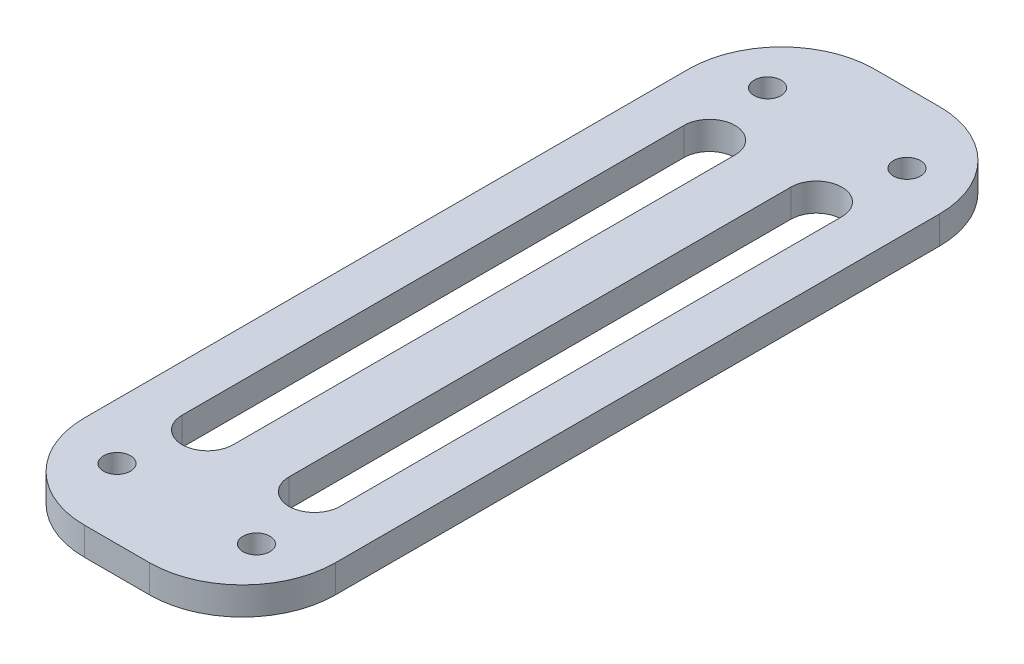
ISO-10303-21;
HEADER;
FILE_DESCRIPTION(('STEP AP214'),'2;1');
FILE_NAME('part.step','',(''),(''),'','','');
FILE_SCHEMA(('AUTOMOTIVE_DESIGN { 1 0 10303 214 1 1 1 1 }'));
ENDSEC;
DATA;
#1=APPLICATION_CONTEXT('core data for automotive mechanical design processes');
#2=APPLICATION_PROTOCOL_DEFINITION('international standard','automotive_design',2000,#1);
#3=PRODUCT_CONTEXT('',#1,'mechanical');
#4=PRODUCT('Part','Part','',(#3));
#5=PRODUCT_RELATED_PRODUCT_CATEGORY('part','',(#4));
#6=PRODUCT_DEFINITION_FORMATION('','',#4);
#7=PRODUCT_DEFINITION_CONTEXT('part definition',#1,'design');
#8=PRODUCT_DEFINITION('design','',#6,#7);
#9=PRODUCT_DEFINITION_SHAPE('','',#8);
#10=(LENGTH_UNIT() NAMED_UNIT(*) SI_UNIT(.MILLI.,.METRE.));
#11=(NAMED_UNIT(*) PLANE_ANGLE_UNIT() SI_UNIT($,.RADIAN.));
#12=(NAMED_UNIT(*) SI_UNIT($,.STERADIAN.) SOLID_ANGLE_UNIT());
#13=UNCERTAINTY_MEASURE_WITH_UNIT(LENGTH_MEASURE(1.E-05),#10,'distance_accuracy_value','');
#14=(GEOMETRIC_REPRESENTATION_CONTEXT(3) GLOBAL_UNCERTAINTY_ASSIGNED_CONTEXT((#13)) GLOBAL_UNIT_ASSIGNED_CONTEXT((#10,
#11,#12)) REPRESENTATION_CONTEXT('',''));
#15=CARTESIAN_POINT('',(0.,0.,0.));
#16=DIRECTION('',(0.,0.,1.));
#17=DIRECTION('',(1.,0.,0.));
#18=AXIS2_PLACEMENT_3D('',#15,#16,#17);
#19=CARTESIAN_POINT('',(0.,3.,0.));
#20=DIRECTION('',(1.,0.,0.));
#21=DIRECTION('',(0.,0.,-1.));
#22=AXIS2_PLACEMENT_3D('',#19,#20,#21);
#23=PLANE('',#22);
#24=DIRECTION('',(0.,0.,1.));
#25=VECTOR('',#24,1.);
#26=CARTESIAN_POINT('',(0.,3.,0.));
#27=LINE('',#26,#25);
#28=CARTESIAN_POINT('',(0.,3.,-75.));
#29=VERTEX_POINT('',#28);
#30=CARTESIAN_POINT('',(0.,3.,-10.));
#31=VERTEX_POINT('',#30);
#32=EDGE_CURVE('E255',#29,#31,#27,.T.);
#33=ORIENTED_EDGE('',*,*,#32,.F.);
#34=DIRECTION('',(0.,-1.,0.));
#35=VECTOR('',#34,1.);
#36=CARTESIAN_POINT('',(0.,3.,-75.));
#37=LINE('',#36,#35);
#38=CARTESIAN_POINT('',(0.,0.,-75.));
#39=VERTEX_POINT('',#38);
#40=EDGE_CURVE('E277',#29,#39,#37,.T.);
#41=ORIENTED_EDGE('',*,*,#40,.T.);
#42=DIRECTION('',(0.,0.,1.));
#43=VECTOR('',#42,1.);
#44=CARTESIAN_POINT('',(0.,0.,0.));
#45=LINE('',#44,#43);
#46=CARTESIAN_POINT('',(0.,0.,-10.));
#47=VERTEX_POINT('',#46);
#48=EDGE_CURVE('E252',#39,#47,#45,.T.);
#49=ORIENTED_EDGE('',*,*,#48,.T.);
#50=DIRECTION('',(0.,-1.,0.));
#51=VECTOR('',#50,1.);
#52=CARTESIAN_POINT('',(0.,3.,-10.));
#53=LINE('',#52,#51);
#54=EDGE_CURVE('E266',#47,#31,#53,.F.);
#55=ORIENTED_EDGE('',*,*,#54,.T.);
#56=EDGE_LOOP('',(#33,#41,#49,#55));
#57=FACE_BOUND('',#56,.T.);
#58=ADVANCED_FACE('F41',(#57),#23,.F.);
#59=CARTESIAN_POINT('',(0.,3.,0.));
#60=DIRECTION('',(0.,0.,-1.));
#61=DIRECTION('',(-1.,0.,0.));
#62=AXIS2_PLACEMENT_3D('',#59,#60,#61);
#63=PLANE('',#62);
#64=DIRECTION('',(1.,0.,0.));
#65=VECTOR('',#64,1.);
#66=CARTESIAN_POINT('',(0.,3.,0.));
#67=LINE('',#66,#65);
#68=CARTESIAN_POINT('',(10.,3.,0.));
#69=VERTEX_POINT('',#68);
#70=CARTESIAN_POINT('',(17.,3.,0.));
#71=VERTEX_POINT('',#70);
#72=EDGE_CURVE('E258',#69,#71,#67,.T.);
#73=ORIENTED_EDGE('',*,*,#72,.F.);
#74=DIRECTION('',(0.,-1.,0.));
#75=VECTOR('',#74,1.);
#76=CARTESIAN_POINT('',(10.,3.,0.));
#77=LINE('',#76,#75);
#78=CARTESIAN_POINT('',(10.,0.,0.));
#79=VERTEX_POINT('',#78);
#80=EDGE_CURVE('E302',#69,#79,#77,.T.);
#81=ORIENTED_EDGE('',*,*,#80,.T.);
#82=DIRECTION('',(1.,0.,0.));
#83=VECTOR('',#82,1.);
#84=CARTESIAN_POINT('',(0.,0.,0.));
#85=LINE('',#84,#83);
#86=CARTESIAN_POINT('',(17.,0.,0.));
#87=VERTEX_POINT('',#86);
#88=EDGE_CURVE('E269',#79,#87,#85,.T.);
#89=ORIENTED_EDGE('',*,*,#88,.T.);
#90=DIRECTION('',(0.,-1.,0.));
#91=VECTOR('',#90,1.);
#92=CARTESIAN_POINT('',(17.,3.,0.));
#93=LINE('',#92,#91);
#94=EDGE_CURVE('E300',#87,#71,#93,.F.);
#95=ORIENTED_EDGE('',*,*,#94,.T.);
#96=EDGE_LOOP('',(#73,#81,#89,#95));
#97=FACE_BOUND('',#96,.T.);
#98=ADVANCED_FACE('F308',(#97),#63,.F.);
#99=CARTESIAN_POINT('',(27.,3.,0.));
#100=DIRECTION('',(-1.,0.,0.));
#101=DIRECTION('',(0.,0.,1.));
#102=AXIS2_PLACEMENT_3D('',#99,#100,#101);
#103=PLANE('',#102);
#104=DIRECTION('',(0.,0.,-1.));
#105=VECTOR('',#104,1.);
#106=CARTESIAN_POINT('',(27.,3.,0.));
#107=LINE('',#106,#105);
#108=CARTESIAN_POINT('',(27.,3.,-10.));
#109=VERTEX_POINT('',#108);
#110=CARTESIAN_POINT('',(27.,3.,-75.));
#111=VERTEX_POINT('',#110);
#112=EDGE_CURVE('E261',#109,#111,#107,.T.);
#113=ORIENTED_EDGE('',*,*,#112,.F.);
#114=DIRECTION('',(0.,-1.,0.));
#115=VECTOR('',#114,1.);
#116=CARTESIAN_POINT('',(27.,3.,-10.));
#117=LINE('',#116,#115);
#118=CARTESIAN_POINT('',(27.,0.,-10.));
#119=VERTEX_POINT('',#118);
#120=EDGE_CURVE('E11',#109,#119,#117,.T.);
#121=ORIENTED_EDGE('',*,*,#120,.T.);
#122=DIRECTION('',(0.,0.,-1.));
#123=VECTOR('',#122,1.);
#124=CARTESIAN_POINT('',(27.,0.,0.));
#125=LINE('',#124,#123);
#126=CARTESIAN_POINT('',(27.,0.,-75.));
#127=VERTEX_POINT('',#126);
#128=EDGE_CURVE('E272',#119,#127,#125,.T.);
#129=ORIENTED_EDGE('',*,*,#128,.T.);
#130=DIRECTION('',(0.,-1.,0.));
#131=VECTOR('',#130,1.);
#132=CARTESIAN_POINT('',(27.,3.,-75.));
#133=LINE('',#132,#131);
#134=EDGE_CURVE('E49',#127,#111,#133,.F.);
#135=ORIENTED_EDGE('',*,*,#134,.T.);
#136=EDGE_LOOP('',(#113,#121,#129,#135));
#137=FACE_BOUND('',#136,.T.);
#138=ADVANCED_FACE('F318',(#137),#103,.F.);
#139=CARTESIAN_POINT('',(0.,3.,-85.));
#140=DIRECTION('',(0.,0.,1.));
#141=DIRECTION('',(1.,0.,0.));
#142=AXIS2_PLACEMENT_3D('',#139,#140,#141);
#143=PLANE('',#142);
#144=DIRECTION('',(-1.,0.,0.));
#145=VECTOR('',#144,1.);
#146=CARTESIAN_POINT('',(0.,0.,-85.));
#147=LINE('',#146,#145);
#148=CARTESIAN_POINT('',(17.,0.,-85.));
#149=VERTEX_POINT('',#148);
#150=CARTESIAN_POINT('',(9.99999999999999,0.,-85.));
#151=VERTEX_POINT('',#150);
#152=EDGE_CURVE('E259',#149,#151,#147,.T.);
#153=ORIENTED_EDGE('',*,*,#152,.T.);
#154=DIRECTION('',(0.,-1.,0.));
#155=VECTOR('',#154,1.);
#156=CARTESIAN_POINT('',(9.99999999999999,3.,-85.));
#157=LINE('',#156,#155);
#158=CARTESIAN_POINT('',(9.99999999999999,3.,-85.));
#159=VERTEX_POINT('',#158);
#160=EDGE_CURVE('E291',#151,#159,#157,.F.);
#161=ORIENTED_EDGE('',*,*,#160,.T.);
#162=DIRECTION('',(-1.,0.,0.));
#163=VECTOR('',#162,1.);
#164=CARTESIAN_POINT('',(0.,3.,-85.));
#165=LINE('',#164,#163);
#166=CARTESIAN_POINT('',(17.,3.,-85.));
#167=VERTEX_POINT('',#166);
#168=EDGE_CURVE('E263',#167,#159,#165,.T.);
#169=ORIENTED_EDGE('',*,*,#168,.F.);
#170=DIRECTION('',(0.,-1.,0.));
#171=VECTOR('',#170,1.);
#172=CARTESIAN_POINT('',(17.,3.,-85.));
#173=LINE('',#172,#171);
#174=EDGE_CURVE('E288',#167,#149,#173,.T.);
#175=ORIENTED_EDGE('',*,*,#174,.T.);
#176=EDGE_LOOP('',(#153,#161,#169,#175));
#177=FACE_BOUND('',#176,.T.);
#178=ADVANCED_FACE('F326',(#177),#143,.F.);
#179=CARTESIAN_POINT('',(0.,3.,0.));
#180=DIRECTION('',(0.,-1.,0.));
#181=DIRECTION('',(0.,0.,-1.));
#182=AXIS2_PLACEMENT_3D('',#179,#180,#181);
#183=PLANE('',#182);
#184=DIRECTION('',(0.,0.,1.));
#185=VECTOR('',#184,1.);
#186=CARTESIAN_POINT('',(4.99999999999999,3.,-69.5));
#187=LINE('',#186,#185);
#188=CARTESIAN_POINT('',(4.99999999999999,3.,-69.5));
#189=VERTEX_POINT('',#188);
#190=CARTESIAN_POINT('',(4.99999999999999,3.,-15.5));
#191=VERTEX_POINT('',#190);
#192=EDGE_CURVE('E189',#189,#191,#187,.T.);
#193=ORIENTED_EDGE('',*,*,#192,.F.);
#194=CARTESIAN_POINT('',(7.74999999999999,3.,-69.5));
#195=DIRECTION('',(0.,1.,0.));
#196=DIRECTION('',(0.,0.,1.));
#197=AXIS2_PLACEMENT_3D('',#194,#195,#196);
#198=CIRCLE('',#197,2.75);
#199=CARTESIAN_POINT('',(10.5,3.,-69.5));
#200=VERTEX_POINT('',#199);
#201=EDGE_CURVE('E162',#200,#189,#198,.T.);
#202=ORIENTED_EDGE('',*,*,#201,.F.);
#203=DIRECTION('',(0.,0.,-1.));
#204=VECTOR('',#203,1.);
#205=CARTESIAN_POINT('',(10.5,3.,-69.5));
#206=LINE('',#205,#204);
#207=CARTESIAN_POINT('',(10.5,3.,-15.5));
#208=VERTEX_POINT('',#207);
#209=EDGE_CURVE('E180',#208,#200,#206,.T.);
#210=ORIENTED_EDGE('',*,*,#209,.F.);
#211=CARTESIAN_POINT('',(7.75,3.,-15.5));
#212=DIRECTION('',(0.,1.,0.));
#213=DIRECTION('',(0.,0.,1.));
#214=AXIS2_PLACEMENT_3D('',#211,#212,#213);
#215=CIRCLE('',#214,2.75);
#216=EDGE_CURVE('E183',#191,#208,#215,.T.);
#217=ORIENTED_EDGE('',*,*,#216,.F.);
#218=EDGE_LOOP('',(#193,#202,#210,#217));
#219=FACE_BOUND('',#218,.T.);
#220=DIRECTION('',(0.,0.,1.));
#221=VECTOR('',#220,1.);
#222=CARTESIAN_POINT('',(16.5,3.,-69.5));
#223=LINE('',#222,#221);
#224=CARTESIAN_POINT('',(16.5,3.,-69.5));
#225=VERTEX_POINT('',#224);
#226=CARTESIAN_POINT('',(16.5,3.,-15.5));
#227=VERTEX_POINT('',#226);
#228=EDGE_CURVE('E217',#225,#227,#223,.T.);
#229=ORIENTED_EDGE('',*,*,#228,.F.);
#230=CARTESIAN_POINT('',(19.25,3.,-69.5));
#231=DIRECTION('',(0.,1.,0.));
#232=DIRECTION('',(0.,0.,-1.));
#233=AXIS2_PLACEMENT_3D('',#230,#231,#232);
#234=CIRCLE('',#233,2.75);
#235=CARTESIAN_POINT('',(22.,3.,-69.5));
#236=VERTEX_POINT('',#235);
#237=EDGE_CURVE('E190',#236,#225,#234,.T.);
#238=ORIENTED_EDGE('',*,*,#237,.F.);
#239=DIRECTION('',(0.,0.,-1.));
#240=VECTOR('',#239,1.);
#241=CARTESIAN_POINT('',(22.,3.,-69.5));
#242=LINE('',#241,#240);
#243=CARTESIAN_POINT('',(22.,3.,-15.5));
#244=VERTEX_POINT('',#243);
#245=EDGE_CURVE('E210',#244,#236,#242,.T.);
#246=ORIENTED_EDGE('',*,*,#245,.F.);
#247=CARTESIAN_POINT('',(19.25,3.,-15.5));
#248=DIRECTION('',(0.,1.,0.));
#249=DIRECTION('',(0.,0.,-1.));
#250=AXIS2_PLACEMENT_3D('',#247,#248,#249);
#251=CIRCLE('',#250,2.75);
#252=EDGE_CURVE('E213',#227,#244,#251,.T.);
#253=ORIENTED_EDGE('',*,*,#252,.F.);
#254=EDGE_LOOP('',(#229,#238,#246,#253));
#255=FACE_BOUND('',#254,.T.);
#256=CARTESIAN_POINT('',(6.,3.,-77.5));
#257=DIRECTION('',(0.,1.,0.));
#258=DIRECTION('',(0.,0.,-1.));
#259=AXIS2_PLACEMENT_3D('',#256,#257,#258);
#260=CIRCLE('',#259,1.45);
#261=CARTESIAN_POINT('',(6.,3.,-78.95));
#262=VERTEX_POINT('',#261);
#263=EDGE_CURVE('E244',#262,#262,#260,.T.);
#264=ORIENTED_EDGE('',*,*,#263,.F.);
#265=EDGE_LOOP('',(#264));
#266=FACE_BOUND('',#265,.T.);
#267=CARTESIAN_POINT('',(21.,3.,-77.5));
#268=DIRECTION('',(0.,1.,0.));
#269=DIRECTION('',(0.,0.,1.));
#270=AXIS2_PLACEMENT_3D('',#267,#268,#269);
#271=CIRCLE('',#270,1.45000000000001);
#272=CARTESIAN_POINT('',(21.,3.,-76.05));
#273=VERTEX_POINT('',#272);
#274=EDGE_CURVE('E238',#273,#273,#271,.T.);
#275=ORIENTED_EDGE('',*,*,#274,.F.);
#276=EDGE_LOOP('',(#275));
#277=FACE_BOUND('',#276,.T.);
#278=CARTESIAN_POINT('',(21.,3.,-7.49999999999999));
#279=DIRECTION('',(0.,1.,0.));
#280=DIRECTION('',(0.,0.,-1.));
#281=AXIS2_PLACEMENT_3D('',#278,#279,#280);
#282=CIRCLE('',#281,1.45);
#283=CARTESIAN_POINT('',(21.,3.,-8.94999999999999));
#284=VERTEX_POINT('',#283);
#285=EDGE_CURVE('E231',#284,#284,#282,.T.);
#286=ORIENTED_EDGE('',*,*,#285,.F.);
#287=EDGE_LOOP('',(#286));
#288=FACE_BOUND('',#287,.T.);
#289=CARTESIAN_POINT('',(6.,3.,-7.49999999999999));
#290=DIRECTION('',(0.,1.,0.));
#291=DIRECTION('',(0.,0.,1.));
#292=AXIS2_PLACEMENT_3D('',#289,#290,#291);
#293=CIRCLE('',#292,1.45);
#294=CARTESIAN_POINT('',(6.,3.,-6.04999999999999));
#295=VERTEX_POINT('',#294);
#296=EDGE_CURVE('E234',#295,#295,#293,.T.);
#297=ORIENTED_EDGE('',*,*,#296,.F.);
#298=EDGE_LOOP('',(#297));
#299=FACE_BOUND('',#298,.T.);
#300=ORIENTED_EDGE('',*,*,#168,.T.);
#301=CARTESIAN_POINT('',(9.99999999999999,3.,-75.));
#302=DIRECTION('',(0.,-1.,0.));
#303=DIRECTION('',(0.,0.,-1.));
#304=AXIS2_PLACEMENT_3D('',#301,#302,#303);
#305=CIRCLE('',#304,10.);
#306=EDGE_CURVE('E298',#159,#29,#305,.F.);
#307=ORIENTED_EDGE('',*,*,#306,.T.);
#308=ORIENTED_EDGE('',*,*,#32,.T.);
#309=CARTESIAN_POINT('',(10.,3.,-10.));
#310=DIRECTION('',(0.,-1.,0.));
#311=DIRECTION('',(0.,0.,-1.));
#312=AXIS2_PLACEMENT_3D('',#309,#310,#311);
#313=CIRCLE('',#312,10.);
#314=EDGE_CURVE('E296',#31,#69,#313,.F.);
#315=ORIENTED_EDGE('',*,*,#314,.T.);
#316=ORIENTED_EDGE('',*,*,#72,.T.);
#317=CARTESIAN_POINT('',(17.,3.,-10.));
#318=DIRECTION('',(0.,-1.,0.));
#319=DIRECTION('',(0.,0.,-1.));
#320=AXIS2_PLACEMENT_3D('',#317,#318,#319);
#321=CIRCLE('',#320,10.);
#322=EDGE_CURVE('E62',#71,#109,#321,.F.);
#323=ORIENTED_EDGE('',*,*,#322,.T.);
#324=ORIENTED_EDGE('',*,*,#112,.T.);
#325=CARTESIAN_POINT('',(17.,3.,-75.));
#326=DIRECTION('',(0.,-1.,0.));
#327=DIRECTION('',(0.,0.,-1.));
#328=AXIS2_PLACEMENT_3D('',#325,#326,#327);
#329=CIRCLE('',#328,10.);
#330=EDGE_CURVE('E293',#111,#167,#329,.F.);
#331=ORIENTED_EDGE('',*,*,#330,.T.);
#332=EDGE_LOOP('',(#300,#307,#308,#315,#316,#323,#324,#331));
#333=FACE_BOUND('',#332,.T.);
#334=ADVANCED_FACE('F320',(#219,#255,#266,#277,#288,#299,#333),#183,.F.);
#335=CARTESIAN_POINT('',(0.,0.,0.));
#336=DIRECTION('',(0.,-1.,0.));
#337=DIRECTION('',(0.,0.,-1.));
#338=AXIS2_PLACEMENT_3D('',#335,#336,#337);
#339=PLANE('',#338);
#340=CARTESIAN_POINT('',(7.74999999999999,0.,-69.5));
#341=DIRECTION('',(0.,1.,0.));
#342=DIRECTION('',(0.,0.,1.));
#343=AXIS2_PLACEMENT_3D('',#340,#341,#342);
#344=CIRCLE('',#343,2.75);
#345=CARTESIAN_POINT('',(10.5,0.,-69.5));
#346=VERTEX_POINT('',#345);
#347=CARTESIAN_POINT('',(4.99999999999999,0.,-69.5));
#348=VERTEX_POINT('',#347);
#349=EDGE_CURVE('E159',#346,#348,#344,.T.);
#350=ORIENTED_EDGE('',*,*,#349,.T.);
#351=DIRECTION('',(0.,0.,1.));
#352=VECTOR('',#351,1.);
#353=CARTESIAN_POINT('',(4.99999999999999,0.,-69.5));
#354=LINE('',#353,#352);
#355=CARTESIAN_POINT('',(4.99999999999999,0.,-15.5));
#356=VERTEX_POINT('',#355);
#357=EDGE_CURVE('E171',#348,#356,#354,.T.);
#358=ORIENTED_EDGE('',*,*,#357,.T.);
#359=CARTESIAN_POINT('',(7.75,0.,-15.5));
#360=DIRECTION('',(0.,1.,0.));
#361=DIRECTION('',(0.,0.,1.));
#362=AXIS2_PLACEMENT_3D('',#359,#360,#361);
#363=CIRCLE('',#362,2.75);
#364=CARTESIAN_POINT('',(10.5,0.,-15.5));
#365=VERTEX_POINT('',#364);
#366=EDGE_CURVE('E175',#356,#365,#363,.T.);
#367=ORIENTED_EDGE('',*,*,#366,.T.);
#368=DIRECTION('',(0.,0.,-1.));
#369=VECTOR('',#368,1.);
#370=CARTESIAN_POINT('',(10.5,0.,-69.5));
#371=LINE('',#370,#369);
#372=EDGE_CURVE('E167',#365,#346,#371,.T.);
#373=ORIENTED_EDGE('',*,*,#372,.T.);
#374=EDGE_LOOP('',(#350,#358,#367,#373));
#375=FACE_BOUND('',#374,.T.);
#376=CARTESIAN_POINT('',(19.25,0.,-69.5));
#377=DIRECTION('',(0.,1.,0.));
#378=DIRECTION('',(0.,0.,-1.));
#379=AXIS2_PLACEMENT_3D('',#376,#377,#378);
#380=CIRCLE('',#379,2.75);
#381=CARTESIAN_POINT('',(22.,0.,-69.5));
#382=VERTEX_POINT('',#381);
#383=CARTESIAN_POINT('',(16.5,0.,-69.5));
#384=VERTEX_POINT('',#383);
#385=EDGE_CURVE('E214',#382,#384,#380,.T.);
#386=ORIENTED_EDGE('',*,*,#385,.T.);
#387=DIRECTION('',(0.,0.,1.));
#388=VECTOR('',#387,1.);
#389=CARTESIAN_POINT('',(16.5,0.,-69.5));
#390=LINE('',#389,#388);
#391=CARTESIAN_POINT('',(16.5,0.,-15.5));
#392=VERTEX_POINT('',#391);
#393=EDGE_CURVE('E226',#384,#392,#390,.T.);
#394=ORIENTED_EDGE('',*,*,#393,.T.);
#395=CARTESIAN_POINT('',(19.25,0.,-15.5));
#396=DIRECTION('',(0.,1.,0.));
#397=DIRECTION('',(0.,0.,-1.));
#398=AXIS2_PLACEMENT_3D('',#395,#396,#397);
#399=CIRCLE('',#398,2.75);
#400=CARTESIAN_POINT('',(22.,0.,-15.5));
#401=VERTEX_POINT('',#400);
#402=EDGE_CURVE('E223',#392,#401,#399,.T.);
#403=ORIENTED_EDGE('',*,*,#402,.T.);
#404=DIRECTION('',(0.,0.,-1.));
#405=VECTOR('',#404,1.);
#406=CARTESIAN_POINT('',(22.,0.,-69.5));
#407=LINE('',#406,#405);
#408=EDGE_CURVE('E203',#401,#382,#407,.T.);
#409=ORIENTED_EDGE('',*,*,#408,.T.);
#410=EDGE_LOOP('',(#386,#394,#403,#409));
#411=FACE_BOUND('',#410,.T.);
#412=CARTESIAN_POINT('',(6.,0.,-77.5));
#413=DIRECTION('',(0.,1.,0.));
#414=DIRECTION('',(0.,0.,-1.));
#415=AXIS2_PLACEMENT_3D('',#412,#413,#414);
#416=CIRCLE('',#415,1.45);
#417=CARTESIAN_POINT('',(6.,0.,-78.95));
#418=VERTEX_POINT('',#417);
#419=EDGE_CURVE('E196',#418,#418,#416,.T.);
#420=ORIENTED_EDGE('',*,*,#419,.T.);
#421=EDGE_LOOP('',(#420));
#422=FACE_BOUND('',#421,.T.);
#423=CARTESIAN_POINT('',(21.,0.,-77.5));
#424=DIRECTION('',(0.,1.,0.));
#425=DIRECTION('',(0.,0.,1.));
#426=AXIS2_PLACEMENT_3D('',#423,#424,#425);
#427=CIRCLE('',#426,1.45000000000001);
#428=CARTESIAN_POINT('',(21.,0.,-76.05));
#429=VERTEX_POINT('',#428);
#430=EDGE_CURVE('E241',#429,#429,#427,.T.);
#431=ORIENTED_EDGE('',*,*,#430,.T.);
#432=EDGE_LOOP('',(#431));
#433=FACE_BOUND('',#432,.T.);
#434=CARTESIAN_POINT('',(21.,0.,-7.49999999999999));
#435=DIRECTION('',(0.,1.,0.));
#436=DIRECTION('',(0.,0.,-1.));
#437=AXIS2_PLACEMENT_3D('',#434,#435,#436);
#438=CIRCLE('',#437,1.45);
#439=CARTESIAN_POINT('',(21.,0.,-8.94999999999999));
#440=VERTEX_POINT('',#439);
#441=EDGE_CURVE('E235',#440,#440,#438,.T.);
#442=ORIENTED_EDGE('',*,*,#441,.T.);
#443=EDGE_LOOP('',(#442));
#444=FACE_BOUND('',#443,.T.);
#445=CARTESIAN_POINT('',(6.,0.,-7.49999999999999));
#446=DIRECTION('',(0.,1.,0.));
#447=DIRECTION('',(0.,0.,1.));
#448=AXIS2_PLACEMENT_3D('',#445,#446,#447);
#449=CIRCLE('',#448,1.45);
#450=CARTESIAN_POINT('',(6.,0.,-6.04999999999999));
#451=VERTEX_POINT('',#450);
#452=EDGE_CURVE('E249',#451,#451,#449,.T.);
#453=ORIENTED_EDGE('',*,*,#452,.T.);
#454=EDGE_LOOP('',(#453));
#455=FACE_BOUND('',#454,.T.);
#456=ORIENTED_EDGE('',*,*,#48,.F.);
#457=CARTESIAN_POINT('',(9.99999999999999,0.,-75.));
#458=DIRECTION('',(0.,-1.,0.));
#459=DIRECTION('',(0.,0.,-1.));
#460=AXIS2_PLACEMENT_3D('',#457,#458,#459);
#461=CIRCLE('',#460,10.);
#462=EDGE_CURVE('E286',#39,#151,#461,.T.);
#463=ORIENTED_EDGE('',*,*,#462,.T.);
#464=ORIENTED_EDGE('',*,*,#152,.F.);
#465=CARTESIAN_POINT('',(17.,0.,-75.));
#466=DIRECTION('',(0.,-1.,0.));
#467=DIRECTION('',(0.,0.,-1.));
#468=AXIS2_PLACEMENT_3D('',#465,#466,#467);
#469=CIRCLE('',#468,10.);
#470=EDGE_CURVE('E280',#149,#127,#469,.T.);
#471=ORIENTED_EDGE('',*,*,#470,.T.);
#472=ORIENTED_EDGE('',*,*,#128,.F.);
#473=CARTESIAN_POINT('',(17.,0.,-10.));
#474=DIRECTION('',(0.,-1.,0.));
#475=DIRECTION('',(0.,0.,-1.));
#476=AXIS2_PLACEMENT_3D('',#473,#474,#475);
#477=CIRCLE('',#476,10.);
#478=EDGE_CURVE('E282',#119,#87,#477,.T.);
#479=ORIENTED_EDGE('',*,*,#478,.T.);
#480=ORIENTED_EDGE('',*,*,#88,.F.);
#481=CARTESIAN_POINT('',(10.,0.,-10.));
#482=DIRECTION('',(0.,-1.,0.));
#483=DIRECTION('',(0.,0.,-1.));
#484=AXIS2_PLACEMENT_3D('',#481,#482,#483);
#485=CIRCLE('',#484,10.);
#486=EDGE_CURVE('E284',#79,#47,#485,.T.);
#487=ORIENTED_EDGE('',*,*,#486,.T.);
#488=EDGE_LOOP('',(#456,#463,#464,#471,#472,#479,#480,#487));
#489=FACE_BOUND('',#488,.T.);
#490=ADVANCED_FACE('F177',(#375,#411,#422,#433,#444,#455,#489),#339,.T.);
#491=CARTESIAN_POINT('',(6.,0.,-7.49999999999999));
#492=DIRECTION('',(0.,1.,0.));
#493=DIRECTION('',(0.,0.,1.));
#494=AXIS2_PLACEMENT_3D('',#491,#492,#493);
#495=CYLINDRICAL_SURFACE('',#494,1.45);
#496=ORIENTED_EDGE('',*,*,#452,.F.);
#497=EDGE_LOOP('',(#496));
#498=FACE_BOUND('',#497,.T.);
#499=ORIENTED_EDGE('',*,*,#296,.T.);
#500=EDGE_LOOP('',(#499));
#501=FACE_BOUND('',#500,.T.);
#502=ADVANCED_FACE('F357',(#498,#501),#495,.F.);
#503=CARTESIAN_POINT('',(21.,0.,-7.49999999999999));
#504=DIRECTION('',(0.,1.,0.));
#505=DIRECTION('',(0.,0.,1.));
#506=AXIS2_PLACEMENT_3D('',#503,#504,#505);
#507=CYLINDRICAL_SURFACE('',#506,1.45);
#508=ORIENTED_EDGE('',*,*,#441,.F.);
#509=EDGE_LOOP('',(#508));
#510=FACE_BOUND('',#509,.T.);
#511=ORIENTED_EDGE('',*,*,#285,.T.);
#512=EDGE_LOOP('',(#511));
#513=FACE_BOUND('',#512,.T.);
#514=ADVANCED_FACE('F363',(#510,#513),#507,.F.);
#515=CARTESIAN_POINT('',(21.,0.,-77.5));
#516=DIRECTION('',(0.,1.,0.));
#517=DIRECTION('',(0.,0.,1.));
#518=AXIS2_PLACEMENT_3D('',#515,#516,#517);
#519=CYLINDRICAL_SURFACE('',#518,1.45000000000001);
#520=ORIENTED_EDGE('',*,*,#430,.F.);
#521=EDGE_LOOP('',(#520));
#522=FACE_BOUND('',#521,.T.);
#523=ORIENTED_EDGE('',*,*,#274,.T.);
#524=EDGE_LOOP('',(#523));
#525=FACE_BOUND('',#524,.T.);
#526=ADVANCED_FACE('F369',(#522,#525),#519,.F.);
#527=CARTESIAN_POINT('',(6.,0.,-77.5));
#528=DIRECTION('',(0.,1.,0.));
#529=DIRECTION('',(0.,0.,1.));
#530=AXIS2_PLACEMENT_3D('',#527,#528,#529);
#531=CYLINDRICAL_SURFACE('',#530,1.45);
#532=ORIENTED_EDGE('',*,*,#419,.F.);
#533=EDGE_LOOP('',(#532));
#534=FACE_BOUND('',#533,.T.);
#535=ORIENTED_EDGE('',*,*,#263,.T.);
#536=EDGE_LOOP('',(#535));
#537=FACE_BOUND('',#536,.T.);
#538=ADVANCED_FACE('F365',(#534,#537),#531,.F.);
#539=CARTESIAN_POINT('',(19.25,0.,-69.5));
#540=DIRECTION('',(0.,1.,0.));
#541=DIRECTION('',(0.,0.,1.));
#542=AXIS2_PLACEMENT_3D('',#539,#540,#541);
#543=CYLINDRICAL_SURFACE('',#542,2.75);
#544=ORIENTED_EDGE('',*,*,#237,.T.);
#545=DIRECTION('',(0.,1.,0.));
#546=VECTOR('',#545,1.);
#547=CARTESIAN_POINT('',(16.5,0.,-69.5));
#548=LINE('',#547,#546);
#549=EDGE_CURVE('E200',#384,#225,#548,.T.);
#550=ORIENTED_EDGE('',*,*,#549,.F.);
#551=ORIENTED_EDGE('',*,*,#385,.F.);
#552=DIRECTION('',(0.,1.,0.));
#553=VECTOR('',#552,1.);
#554=CARTESIAN_POINT('',(22.,0.,-69.5));
#555=LINE('',#554,#553);
#556=EDGE_CURVE('E208',#382,#236,#555,.T.);
#557=ORIENTED_EDGE('',*,*,#556,.T.);
#558=EDGE_LOOP('',(#544,#550,#551,#557));
#559=FACE_BOUND('',#558,.T.);
#560=ADVANCED_FACE('F368',(#559),#543,.F.);
#561=CARTESIAN_POINT('',(22.,0.,-69.5));
#562=DIRECTION('',(1.,0.,0.));
#563=DIRECTION('',(0.,0.,-1.));
#564=AXIS2_PLACEMENT_3D('',#561,#562,#563);
#565=PLANE('',#564);
#566=ORIENTED_EDGE('',*,*,#245,.T.);
#567=ORIENTED_EDGE('',*,*,#556,.F.);
#568=ORIENTED_EDGE('',*,*,#408,.F.);
#569=DIRECTION('',(0.,1.,0.));
#570=VECTOR('',#569,1.);
#571=CARTESIAN_POINT('',(22.,0.,-15.5));
#572=LINE('',#571,#570);
#573=EDGE_CURVE('E206',#401,#244,#572,.T.);
#574=ORIENTED_EDGE('',*,*,#573,.T.);
#575=EDGE_LOOP('',(#566,#567,#568,#574));
#576=FACE_BOUND('',#575,.T.);
#577=ADVANCED_FACE('F377',(#576),#565,.F.);
#578=CARTESIAN_POINT('',(19.25,0.,-15.5));
#579=DIRECTION('',(0.,1.,0.));
#580=DIRECTION('',(0.,0.,1.));
#581=AXIS2_PLACEMENT_3D('',#578,#579,#580);
#582=CYLINDRICAL_SURFACE('',#581,2.75);
#583=ORIENTED_EDGE('',*,*,#252,.T.);
#584=ORIENTED_EDGE('',*,*,#573,.F.);
#585=ORIENTED_EDGE('',*,*,#402,.F.);
#586=DIRECTION('',(0.,1.,0.));
#587=VECTOR('',#586,1.);
#588=CARTESIAN_POINT('',(16.5,0.,-15.5));
#589=LINE('',#588,#587);
#590=EDGE_CURVE('E204',#392,#227,#589,.T.);
#591=ORIENTED_EDGE('',*,*,#590,.T.);
#592=EDGE_LOOP('',(#583,#584,#585,#591));
#593=FACE_BOUND('',#592,.T.);
#594=ADVANCED_FACE('F380',(#593),#582,.F.);
#595=CARTESIAN_POINT('',(16.5,0.,-69.5));
#596=DIRECTION('',(-1.,0.,0.));
#597=DIRECTION('',(0.,0.,1.));
#598=AXIS2_PLACEMENT_3D('',#595,#596,#597);
#599=PLANE('',#598);
#600=ORIENTED_EDGE('',*,*,#228,.T.);
#601=ORIENTED_EDGE('',*,*,#590,.F.);
#602=ORIENTED_EDGE('',*,*,#393,.F.);
#603=ORIENTED_EDGE('',*,*,#549,.T.);
#604=EDGE_LOOP('',(#600,#601,#602,#603));
#605=FACE_BOUND('',#604,.T.);
#606=ADVANCED_FACE('F384',(#605),#599,.F.);
#607=CARTESIAN_POINT('',(7.74999999999999,0.,-69.5));
#608=DIRECTION('',(0.,1.,0.));
#609=DIRECTION('',(0.,0.,1.));
#610=AXIS2_PLACEMENT_3D('',#607,#608,#609);
#611=CYLINDRICAL_SURFACE('',#610,2.75);
#612=ORIENTED_EDGE('',*,*,#201,.T.);
#613=DIRECTION('',(0.,1.,0.));
#614=VECTOR('',#613,1.);
#615=CARTESIAN_POINT('',(4.99999999999999,0.,-69.5));
#616=LINE('',#615,#614);
#617=EDGE_CURVE('E155',#348,#189,#616,.T.);
#618=ORIENTED_EDGE('',*,*,#617,.F.);
#619=ORIENTED_EDGE('',*,*,#349,.F.);
#620=DIRECTION('',(0.,1.,0.));
#621=VECTOR('',#620,1.);
#622=CARTESIAN_POINT('',(10.5,0.,-69.5));
#623=LINE('',#622,#621);
#624=EDGE_CURVE('E194',#346,#200,#623,.T.);
#625=ORIENTED_EDGE('',*,*,#624,.T.);
#626=EDGE_LOOP('',(#612,#618,#619,#625));
#627=FACE_BOUND('',#626,.T.);
#628=ADVANCED_FACE('F157',(#627),#611,.F.);
#629=CARTESIAN_POINT('',(10.5,0.,-69.5));
#630=DIRECTION('',(1.,0.,0.));
#631=DIRECTION('',(0.,0.,-1.));
#632=AXIS2_PLACEMENT_3D('',#629,#630,#631);
#633=PLANE('',#632);
#634=ORIENTED_EDGE('',*,*,#209,.T.);
#635=ORIENTED_EDGE('',*,*,#624,.F.);
#636=ORIENTED_EDGE('',*,*,#372,.F.);
#637=DIRECTION('',(0.,1.,0.));
#638=VECTOR('',#637,1.);
#639=CARTESIAN_POINT('',(10.5,0.,-15.5));
#640=LINE('',#639,#638);
#641=EDGE_CURVE('E197',#365,#208,#640,.T.);
#642=ORIENTED_EDGE('',*,*,#641,.T.);
#643=EDGE_LOOP('',(#634,#635,#636,#642));
#644=FACE_BOUND('',#643,.T.);
#645=ADVANCED_FACE('F394',(#644),#633,.F.);
#646=CARTESIAN_POINT('',(7.75,0.,-15.5));
#647=DIRECTION('',(0.,1.,0.));
#648=DIRECTION('',(0.,0.,1.));
#649=AXIS2_PLACEMENT_3D('',#646,#647,#648);
#650=CYLINDRICAL_SURFACE('',#649,2.75);
#651=ORIENTED_EDGE('',*,*,#216,.T.);
#652=ORIENTED_EDGE('',*,*,#641,.F.);
#653=ORIENTED_EDGE('',*,*,#366,.F.);
#654=DIRECTION('',(0.,1.,0.));
#655=VECTOR('',#654,1.);
#656=CARTESIAN_POINT('',(4.99999999999999,0.,-15.5));
#657=LINE('',#656,#655);
#658=EDGE_CURVE('E166',#356,#191,#657,.T.);
#659=ORIENTED_EDGE('',*,*,#658,.T.);
#660=EDGE_LOOP('',(#651,#652,#653,#659));
#661=FACE_BOUND('',#660,.T.);
#662=ADVANCED_FACE('F396',(#661),#650,.F.);
#663=CARTESIAN_POINT('',(4.99999999999999,0.,-69.5));
#664=DIRECTION('',(-1.,0.,0.));
#665=DIRECTION('',(0.,0.,1.));
#666=AXIS2_PLACEMENT_3D('',#663,#664,#665);
#667=PLANE('',#666);
#668=ORIENTED_EDGE('',*,*,#192,.T.);
#669=ORIENTED_EDGE('',*,*,#658,.F.);
#670=ORIENTED_EDGE('',*,*,#357,.F.);
#671=ORIENTED_EDGE('',*,*,#617,.T.);
#672=EDGE_LOOP('',(#668,#669,#670,#671));
#673=FACE_BOUND('',#672,.T.);
#674=ADVANCED_FACE('F172',(#673),#667,.F.);
#675=CARTESIAN_POINT('',(9.99999999999999,3.,-75.));
#676=DIRECTION('',(0.,-1.,0.));
#677=DIRECTION('',(0.,0.,-1.));
#678=AXIS2_PLACEMENT_3D('',#675,#676,#677);
#679=CYLINDRICAL_SURFACE('',#678,10.);
#680=ORIENTED_EDGE('',*,*,#306,.F.);
#681=ORIENTED_EDGE('',*,*,#160,.F.);
#682=ORIENTED_EDGE('',*,*,#462,.F.);
#683=ORIENTED_EDGE('',*,*,#40,.F.);
#684=EDGE_LOOP('',(#680,#681,#682,#683));
#685=FACE_BOUND('',#684,.T.);
#686=ADVANCED_FACE('F331',(#685),#679,.T.);
#687=CARTESIAN_POINT('',(10.,3.,-10.));
#688=DIRECTION('',(0.,-1.,0.));
#689=DIRECTION('',(0.,0.,-1.));
#690=AXIS2_PLACEMENT_3D('',#687,#688,#689);
#691=CYLINDRICAL_SURFACE('',#690,10.);
#692=ORIENTED_EDGE('',*,*,#314,.F.);
#693=ORIENTED_EDGE('',*,*,#54,.F.);
#694=ORIENTED_EDGE('',*,*,#486,.F.);
#695=ORIENTED_EDGE('',*,*,#80,.F.);
#696=EDGE_LOOP('',(#692,#693,#694,#695));
#697=FACE_BOUND('',#696,.T.);
#698=ADVANCED_FACE('F335',(#697),#691,.T.);
#699=CARTESIAN_POINT('',(17.,3.,-10.));
#700=DIRECTION('',(0.,-1.,0.));
#701=DIRECTION('',(0.,0.,-1.));
#702=AXIS2_PLACEMENT_3D('',#699,#700,#701);
#703=CYLINDRICAL_SURFACE('',#702,10.);
#704=ORIENTED_EDGE('',*,*,#322,.F.);
#705=ORIENTED_EDGE('',*,*,#94,.F.);
#706=ORIENTED_EDGE('',*,*,#478,.F.);
#707=ORIENTED_EDGE('',*,*,#120,.F.);
#708=EDGE_LOOP('',(#704,#705,#706,#707));
#709=FACE_BOUND('',#708,.T.);
#710=ADVANCED_FACE('F317',(#709),#703,.T.);
#711=CARTESIAN_POINT('',(17.,3.,-75.));
#712=DIRECTION('',(0.,-1.,0.));
#713=DIRECTION('',(0.,0.,-1.));
#714=AXIS2_PLACEMENT_3D('',#711,#712,#713);
#715=CYLINDRICAL_SURFACE('',#714,10.);
#716=ORIENTED_EDGE('',*,*,#330,.F.);
#717=ORIENTED_EDGE('',*,*,#134,.F.);
#718=ORIENTED_EDGE('',*,*,#470,.F.);
#719=ORIENTED_EDGE('',*,*,#174,.F.);
#720=EDGE_LOOP('',(#716,#717,#718,#719));
#721=FACE_BOUND('',#720,.T.);
#722=ADVANCED_FACE('F43',(#721),#715,.T.);
#723=CLOSED_SHELL('',(#58,#98,#138,#178,#334,#490,#502,#514,#526,#538,#560,#577,#594,#606,#628,
#645,#662,#674,#686,#698,#710,#722));
#724=MANIFOLD_SOLID_BREP('B2',#723);
#725=ADVANCED_BREP_SHAPE_REPRESENTATION('',(#18,#724),#14);
#726=SHAPE_DEFINITION_REPRESENTATION(#9,#725);
ENDSEC;
END-ISO-10303-21;
